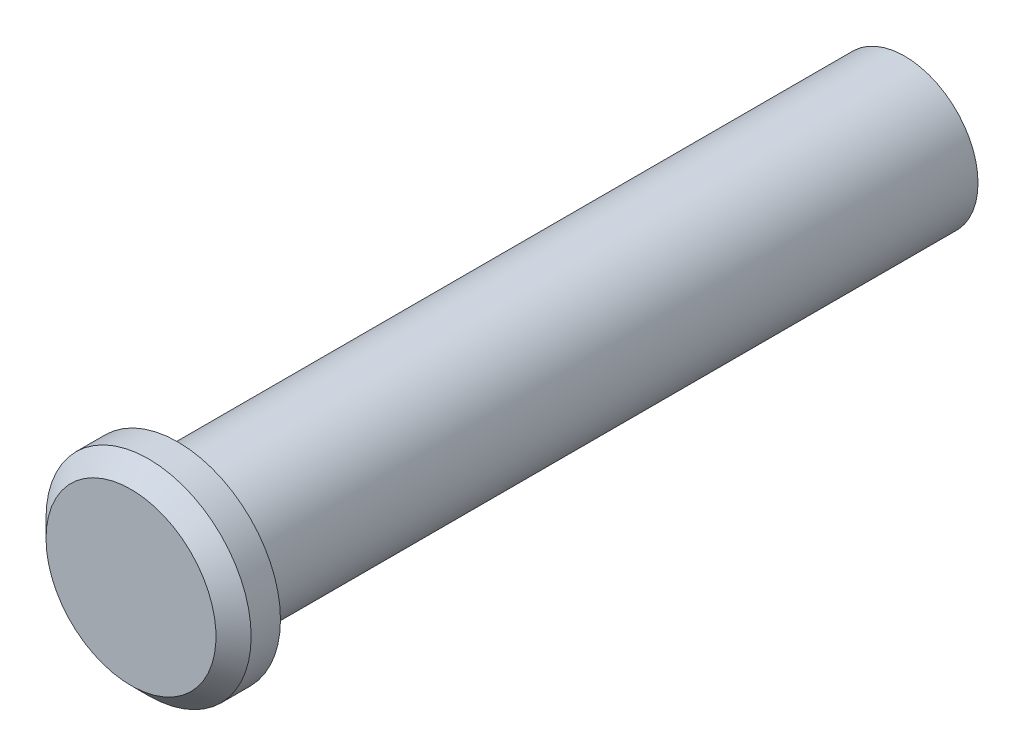
ISO-10303-21;
HEADER;
FILE_DESCRIPTION(('STEP AP214'),'2;1');
FILE_NAME('part.step','',(''),(''),'','','');
FILE_SCHEMA(('AUTOMOTIVE_DESIGN { 1 0 10303 214 1 1 1 1 }'));
ENDSEC;
DATA;
#1=APPLICATION_CONTEXT('core data for automotive mechanical design processes');
#2=APPLICATION_PROTOCOL_DEFINITION('international standard','automotive_design',2000,#1);
#3=PRODUCT_CONTEXT('',#1,'mechanical');
#4=PRODUCT('Part','Part','',(#3));
#5=PRODUCT_RELATED_PRODUCT_CATEGORY('part','',(#4));
#6=PRODUCT_DEFINITION_FORMATION('','',#4);
#7=PRODUCT_DEFINITION_CONTEXT('part definition',#1,'design');
#8=PRODUCT_DEFINITION('design','',#6,#7);
#9=PRODUCT_DEFINITION_SHAPE('','',#8);
#10=(LENGTH_UNIT() NAMED_UNIT(*) SI_UNIT(.MILLI.,.METRE.));
#11=(NAMED_UNIT(*) PLANE_ANGLE_UNIT() SI_UNIT($,.RADIAN.));
#12=(NAMED_UNIT(*) SI_UNIT($,.STERADIAN.) SOLID_ANGLE_UNIT());
#13=UNCERTAINTY_MEASURE_WITH_UNIT(LENGTH_MEASURE(1.E-05),#10,'distance_accuracy_value','');
#14=(GEOMETRIC_REPRESENTATION_CONTEXT(3) GLOBAL_UNCERTAINTY_ASSIGNED_CONTEXT((#13)) GLOBAL_UNIT_ASSIGNED_CONTEXT((#10,
#11,#12)) REPRESENTATION_CONTEXT('',''));
#15=CARTESIAN_POINT('',(0.,0.,0.));
#16=DIRECTION('',(0.,0.,1.));
#17=DIRECTION('',(1.,0.,0.));
#18=AXIS2_PLACEMENT_3D('',#15,#16,#17);
#19=CARTESIAN_POINT('',(0.,0.,0.8));
#20=DIRECTION('',(0.,0.,1.));
#21=DIRECTION('',(1.,0.,0.));
#22=AXIS2_PLACEMENT_3D('',#19,#20,#21);
#23=PLANE('',#22);
#24=CARTESIAN_POINT('',(0.,0.,0.800000000026557));
#25=DIRECTION('',(0.,0.,-1.));
#26=DIRECTION('',(-1.,0.,0.));
#27=AXIS2_PLACEMENT_3D('',#24,#25,#26);
#28=CIRCLE('',#27,1.45000000003392);
#29=CARTESIAN_POINT('',(-1.45000000003392,0.,0.800000000026557));
#30=VERTEX_POINT('',#29);
#31=EDGE_CURVE('E19',#30,#30,#28,.T.);
#32=ORIENTED_EDGE('',*,*,#31,.F.);
#33=EDGE_LOOP('',(#32));
#34=FACE_BOUND('',#33,.T.);
#35=ADVANCED_FACE('F16',(#34),#23,.T.);
#36=CARTESIAN_POINT('',(0.,0.,-8.89999999999991));
#37=DIRECTION('',(0.,0.,-1.));
#38=DIRECTION('',(-1.,0.,0.));
#39=AXIS2_PLACEMENT_3D('',#36,#37,#38);
#40=CONICAL_SURFACE('',#39,0.999999999999902,1.04719755119649);
#41=CARTESIAN_POINT('',(-1.11022302462516E-13,0.,-8.32264973081021));
#42=VERTEX_POINT('',#41);
#43=VERTEX_LOOP('',#42);
#44=FACE_BOUND('',#43,.T.);
#45=CARTESIAN_POINT('',(0.,0.,-8.90000000000002));
#46=DIRECTION('',(0.,0.,1.));
#47=DIRECTION('',(1.,0.,0.));
#48=AXIS2_PLACEMENT_3D('',#45,#46,#47);
#49=CIRCLE('',#48,0.999999999999994);
#50=CARTESIAN_POINT('',(1.00000000000001,0.,-8.90000000000002));
#51=VERTEX_POINT('',#50);
#52=EDGE_CURVE('E34',#51,#51,#49,.F.);
#53=ORIENTED_EDGE('',*,*,#52,.T.);
#54=EDGE_LOOP('',(#53));
#55=FACE_BOUND('',#54,.T.);
#56=ADVANCED_FACE('F28',(#44,#55),#40,.F.);
#57=CARTESIAN_POINT('',(0.,0.,0.50000000004502));
#58=DIRECTION('',(0.,0.,-1.));
#59=DIRECTION('',(-1.,0.,0.));
#60=AXIS2_PLACEMENT_3D('',#57,#58,#59);
#61=CONICAL_SURFACE('',#60,1.74999999995862,0.785398163302709);
#62=ORIENTED_EDGE('',*,*,#31,.T.);
#63=EDGE_LOOP('',(#62));
#64=FACE_BOUND('',#63,.T.);
#65=CARTESIAN_POINT('',(0.,0.,0.500000000000004));
#66=DIRECTION('',(0.,0.,-1.));
#67=DIRECTION('',(-1.,0.,0.));
#68=AXIS2_PLACEMENT_3D('',#65,#66,#67);
#69=CIRCLE('',#68,1.75);
#70=CARTESIAN_POINT('',(-1.75,0.,0.500000000000004));
#71=VERTEX_POINT('',#70);
#72=EDGE_CURVE('E36',#71,#71,#69,.T.);
#73=ORIENTED_EDGE('',*,*,#72,.F.);
#74=EDGE_LOOP('',(#73));
#75=FACE_BOUND('',#74,.T.);
#76=ADVANCED_FACE('F31',(#64,#75),#61,.T.);
#77=CARTESIAN_POINT('',(3.49191704197838E-12,0.,987.7));
#78=DIRECTION('',(0.,0.,1.));
#79=DIRECTION('',(1.,0.,0.));
#80=AXIS2_PLACEMENT_3D('',#77,#78,#79);
#81=CYLINDRICAL_SURFACE('',#80,0.999999999999994);
#82=ORIENTED_EDGE('',*,*,#52,.F.);
#83=EDGE_LOOP('',(#82));
#84=FACE_BOUND('',#83,.T.);
#85=CARTESIAN_POINT('',(0.,0.,-12.4));
#86=DIRECTION('',(0.,0.,1.));
#87=DIRECTION('',(1.,0.,0.));
#88=AXIS2_PLACEMENT_3D('',#85,#86,#87);
#89=CIRCLE('',#88,0.999999999999994);
#90=CARTESIAN_POINT('',(0.999999999999994,0.,-12.4));
#91=VERTEX_POINT('',#90);
#92=EDGE_CURVE('E40',#91,#91,#89,.T.);
#93=ORIENTED_EDGE('',*,*,#92,.F.);
#94=EDGE_LOOP('',(#93));
#95=FACE_BOUND('',#94,.T.);
#96=ADVANCED_FACE('F55',(#84,#95),#81,.F.);
#97=CARTESIAN_POINT('',(0.,0.,0.8));
#98=DIRECTION('',(0.,0.,-1.));
#99=DIRECTION('',(-1.,0.,0.));
#100=AXIS2_PLACEMENT_3D('',#97,#98,#99);
#101=CYLINDRICAL_SURFACE('',#100,1.75);
#102=ORIENTED_EDGE('',*,*,#72,.T.);
#103=EDGE_LOOP('',(#102));
#104=FACE_BOUND('',#103,.T.);
#105=CARTESIAN_POINT('',(0.,0.,0.));
#106=DIRECTION('',(0.,0.,-1.));
#107=DIRECTION('',(-1.,0.,0.));
#108=AXIS2_PLACEMENT_3D('',#105,#106,#107);
#109=CIRCLE('',#108,1.75);
#110=CARTESIAN_POINT('',(-1.75,0.,0.));
#111=VERTEX_POINT('',#110);
#112=EDGE_CURVE('E47',#111,#111,#109,.F.);
#113=ORIENTED_EDGE('',*,*,#112,.T.);
#114=EDGE_LOOP('',(#113));
#115=FACE_BOUND('',#114,.T.);
#116=ADVANCED_FACE('F57',(#104,#115),#101,.T.);
#117=CARTESIAN_POINT('',(0.,0.,-12.4));
#118=DIRECTION('',(0.,0.,-1.));
#119=DIRECTION('',(-1.,0.,0.));
#120=AXIS2_PLACEMENT_3D('',#117,#118,#119);
#121=PLANE('',#120);
#122=CARTESIAN_POINT('',(0.,0.,-12.4));
#123=DIRECTION('',(0.,0.,1.));
#124=DIRECTION('',(1.,0.,0.));
#125=AXIS2_PLACEMENT_3D('',#122,#123,#124);
#126=CIRCLE('',#125,1.25);
#127=CARTESIAN_POINT('',(1.25,0.,-12.4));
#128=VERTEX_POINT('',#127);
#129=EDGE_CURVE('E24',#128,#128,#126,.T.);
#130=ORIENTED_EDGE('',*,*,#129,.F.);
#131=EDGE_LOOP('',(#130));
#132=FACE_BOUND('',#131,.T.);
#133=ORIENTED_EDGE('',*,*,#92,.T.);
#134=EDGE_LOOP('',(#133));
#135=FACE_BOUND('',#134,.T.);
#136=ADVANCED_FACE('F53',(#132,#135),#121,.T.);
#137=CARTESIAN_POINT('',(0.,0.,0.));
#138=DIRECTION('',(0.,0.,1.));
#139=DIRECTION('',(1.,0.,0.));
#140=AXIS2_PLACEMENT_3D('',#137,#138,#139);
#141=PLANE('',#140);
#142=CARTESIAN_POINT('',(0.,0.,0.));
#143=DIRECTION('',(0.,0.,1.));
#144=DIRECTION('',(1.,0.,0.));
#145=AXIS2_PLACEMENT_3D('',#142,#143,#144);
#146=CIRCLE('',#145,1.25);
#147=CARTESIAN_POINT('',(1.25,0.,0.));
#148=VERTEX_POINT('',#147);
#149=EDGE_CURVE('E11',#148,#148,#146,.F.);
#150=ORIENTED_EDGE('',*,*,#149,.F.);
#151=EDGE_LOOP('',(#150));
#152=FACE_BOUND('',#151,.T.);
#153=ORIENTED_EDGE('',*,*,#112,.F.);
#154=EDGE_LOOP('',(#153));
#155=FACE_BOUND('',#154,.T.);
#156=ADVANCED_FACE('F71',(#152,#155),#141,.F.);
#157=CARTESIAN_POINT('',(0.,0.,-12.4));
#158=DIRECTION('',(0.,0.,1.));
#159=DIRECTION('',(1.,0.,0.));
#160=AXIS2_PLACEMENT_3D('',#157,#158,#159);
#161=CYLINDRICAL_SURFACE('',#160,1.25);
#162=ORIENTED_EDGE('',*,*,#149,.T.);
#163=EDGE_LOOP('',(#162));
#164=FACE_BOUND('',#163,.T.);
#165=ORIENTED_EDGE('',*,*,#129,.T.);
#166=EDGE_LOOP('',(#165));
#167=FACE_BOUND('',#166,.T.);
#168=ADVANCED_FACE('F69',(#164,#167),#161,.T.);
#169=CLOSED_SHELL('',(#35,#56,#76,#96,#116,#136,#156,#168));
#170=MANIFOLD_SOLID_BREP('B1',#169);
#171=ADVANCED_BREP_SHAPE_REPRESENTATION('',(#18,#170),#14);
#172=SHAPE_DEFINITION_REPRESENTATION(#9,#171);
ENDSEC;
END-ISO-10303-21;
